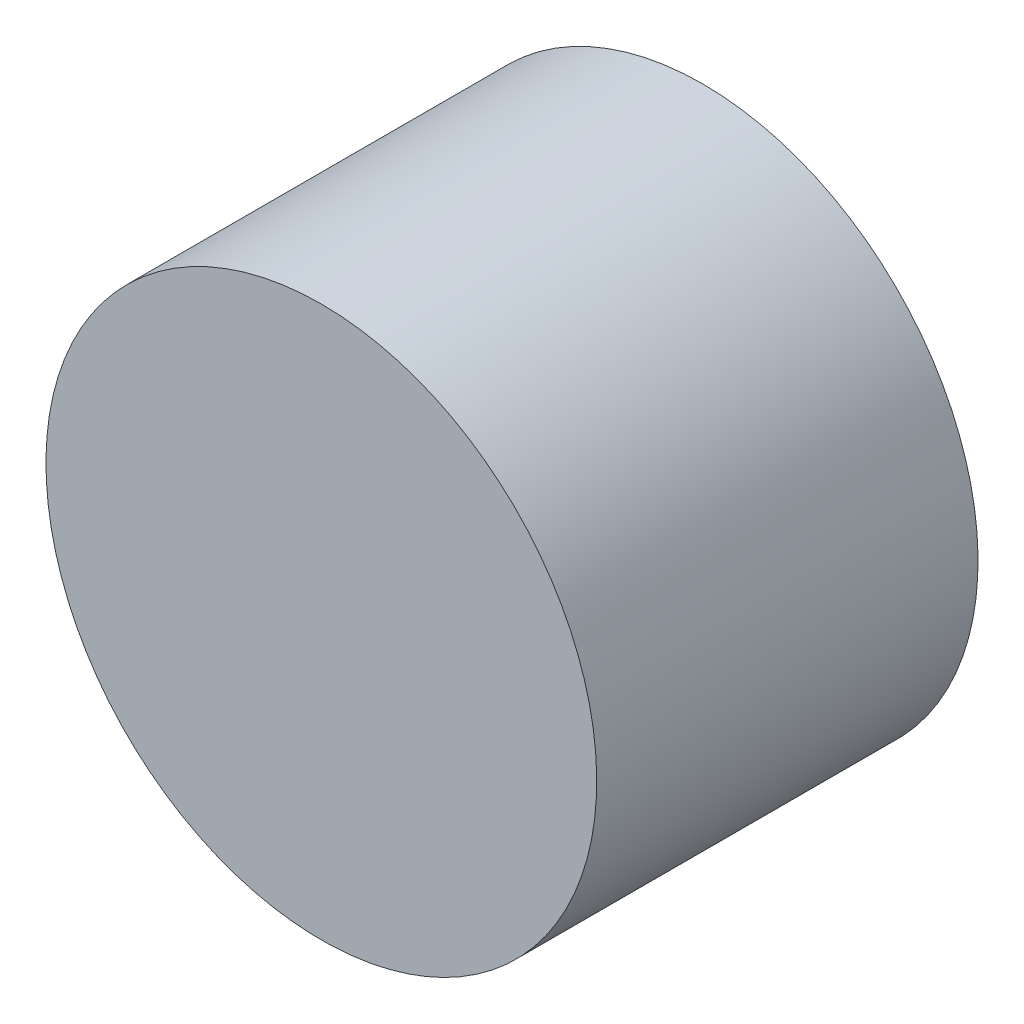
ISO-10303-21;
HEADER;
FILE_DESCRIPTION(('STEP AP214'),'2;1');
FILE_NAME('part.step','',(''),(''),'','','');
FILE_SCHEMA(('AUTOMOTIVE_DESIGN { 1 0 10303 214 1 1 1 1 }'));
ENDSEC;
DATA;
#1=APPLICATION_CONTEXT('core data for automotive mechanical design processes');
#2=APPLICATION_PROTOCOL_DEFINITION('international standard','automotive_design',2000,#1);
#3=PRODUCT_CONTEXT('',#1,'mechanical');
#4=PRODUCT('Part','Part','',(#3));
#5=PRODUCT_RELATED_PRODUCT_CATEGORY('part','',(#4));
#6=PRODUCT_DEFINITION_FORMATION('','',#4);
#7=PRODUCT_DEFINITION_CONTEXT('part definition',#1,'design');
#8=PRODUCT_DEFINITION('design','',#6,#7);
#9=PRODUCT_DEFINITION_SHAPE('','',#8);
#10=(LENGTH_UNIT() NAMED_UNIT(*) SI_UNIT(.MILLI.,.METRE.));
#11=(NAMED_UNIT(*) PLANE_ANGLE_UNIT() SI_UNIT($,.RADIAN.));
#12=(NAMED_UNIT(*) SI_UNIT($,.STERADIAN.) SOLID_ANGLE_UNIT());
#13=UNCERTAINTY_MEASURE_WITH_UNIT(LENGTH_MEASURE(1.E-05),#10,'distance_accuracy_value','');
#14=(GEOMETRIC_REPRESENTATION_CONTEXT(3) GLOBAL_UNCERTAINTY_ASSIGNED_CONTEXT((#13)) GLOBAL_UNIT_ASSIGNED_CONTEXT((#10,
#11,#12)) REPRESENTATION_CONTEXT('',''));
#15=CARTESIAN_POINT('',(0.,0.,0.));
#16=DIRECTION('',(0.,0.,1.));
#17=DIRECTION('',(1.,0.,0.));
#18=AXIS2_PLACEMENT_3D('',#15,#16,#17);
#19=CARTESIAN_POINT('',(0.,0.,0.));
#20=DIRECTION('',(0.,0.,1.));
#21=DIRECTION('',(0.,-1.,0.));
#22=AXIS2_PLACEMENT_3D('',#19,#20,#21);
#23=PLANE('',#22);
#24=CARTESIAN_POINT('',(0.,0.,0.));
#25=DIRECTION('',(0.,0.,-1.));
#26=DIRECTION('',(0.,1.,0.));
#27=AXIS2_PLACEMENT_3D('',#24,#25,#26);
#28=CIRCLE('',#27,130.);
#29=CARTESIAN_POINT('',(0.,130.,0.));
#30=VERTEX_POINT('',#29);
#31=EDGE_CURVE('E10',#30,#30,#28,.T.);
#32=ORIENTED_EDGE('',*,*,#31,.F.);
#33=EDGE_LOOP('',(#32));
#34=FACE_BOUND('',#33,.T.);
#35=ADVANCED_FACE('F37',(#34),#23,.T.);
#36=CARTESIAN_POINT('',(0.,0.,-180.));
#37=DIRECTION('',(0.,0.,-1.));
#38=DIRECTION('',(0.,1.,0.));
#39=AXIS2_PLACEMENT_3D('',#36,#37,#38);
#40=CYLINDRICAL_SURFACE('',#39,130.);
#41=ORIENTED_EDGE('',*,*,#31,.T.);
#42=EDGE_LOOP('',(#41));
#43=FACE_BOUND('',#42,.T.);
#44=CARTESIAN_POINT('',(0.,0.,-180.));
#45=DIRECTION('',(0.,0.,-1.));
#46=DIRECTION('',(0.,1.,0.));
#47=AXIS2_PLACEMENT_3D('',#44,#45,#46);
#48=CIRCLE('',#47,130.);
#49=CARTESIAN_POINT('',(0.,130.,-180.));
#50=VERTEX_POINT('',#49);
#51=EDGE_CURVE('E44',#50,#50,#48,.T.);
#52=ORIENTED_EDGE('',*,*,#51,.F.);
#53=EDGE_LOOP('',(#52));
#54=FACE_BOUND('',#53,.T.);
#55=ADVANCED_FACE('F53',(#43,#54),#40,.T.);
#56=CARTESIAN_POINT('',(0.,130.,-180.));
#57=DIRECTION('',(0.,0.,-1.));
#58=DIRECTION('',(0.,1.,0.));
#59=AXIS2_PLACEMENT_3D('',#56,#57,#58);
#60=PLANE('',#59);
#61=ORIENTED_EDGE('',*,*,#51,.T.);
#62=EDGE_LOOP('',(#61));
#63=FACE_BOUND('',#62,.T.);
#64=ADVANCED_FACE('F51',(#63),#60,.T.);
#65=CLOSED_SHELL('',(#35,#55,#64));
#66=MANIFOLD_SOLID_BREP('B2',#65);
#67=ADVANCED_BREP_SHAPE_REPRESENTATION('',(#18,#66),#14);
#68=SHAPE_DEFINITION_REPRESENTATION(#9,#67);
ENDSEC;
END-ISO-10303-21;
